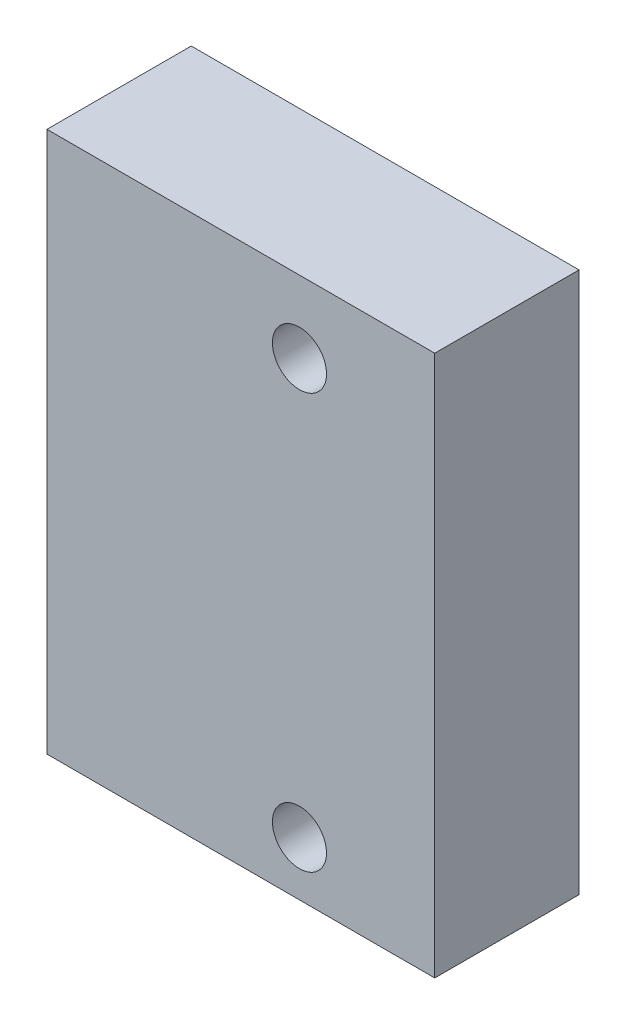
ISO-10303-21;
HEADER;
FILE_DESCRIPTION(('STEP AP214'),'2;1');
FILE_NAME('part.step','',(''),(''),'','','');
FILE_SCHEMA(('AUTOMOTIVE_DESIGN { 1 0 10303 214 1 1 1 1 }'));
ENDSEC;
DATA;
#1=APPLICATION_CONTEXT('core data for automotive mechanical design processes');
#2=APPLICATION_PROTOCOL_DEFINITION('international standard','automotive_design',2000,#1);
#3=PRODUCT_CONTEXT('',#1,'mechanical');
#4=PRODUCT('Part','Part','',(#3));
#5=PRODUCT_RELATED_PRODUCT_CATEGORY('part','',(#4));
#6=PRODUCT_DEFINITION_FORMATION('','',#4);
#7=PRODUCT_DEFINITION_CONTEXT('part definition',#1,'design');
#8=PRODUCT_DEFINITION('design','',#6,#7);
#9=PRODUCT_DEFINITION_SHAPE('','',#8);
#10=(LENGTH_UNIT() NAMED_UNIT(*) SI_UNIT(.MILLI.,.METRE.));
#11=(NAMED_UNIT(*) PLANE_ANGLE_UNIT() SI_UNIT($,.RADIAN.));
#12=(NAMED_UNIT(*) SI_UNIT($,.STERADIAN.) SOLID_ANGLE_UNIT());
#13=UNCERTAINTY_MEASURE_WITH_UNIT(LENGTH_MEASURE(1.E-05),#10,'distance_accuracy_value','');
#14=(GEOMETRIC_REPRESENTATION_CONTEXT(3) GLOBAL_UNCERTAINTY_ASSIGNED_CONTEXT((#13)) GLOBAL_UNIT_ASSIGNED_CONTEXT((#10,
#11,#12)) REPRESENTATION_CONTEXT('',''));
#15=CARTESIAN_POINT('',(0.,0.,0.));
#16=DIRECTION('',(0.,0.,1.));
#17=DIRECTION('',(1.,0.,0.));
#18=AXIS2_PLACEMENT_3D('',#15,#16,#17);
#19=CARTESIAN_POINT('',(0.,60.,16.));
#20=DIRECTION('',(-1.,0.,0.));
#21=DIRECTION('',(0.,0.,1.));
#22=AXIS2_PLACEMENT_3D('',#19,#20,#21);
#23=PLANE('',#22);
#24=DIRECTION('',(0.,1.,0.));
#25=VECTOR('',#24,1.);
#26=CARTESIAN_POINT('',(0.,60.,0.));
#27=LINE('',#26,#25);
#28=CARTESIAN_POINT('',(0.,0.,0.));
#29=VERTEX_POINT('',#28);
#30=CARTESIAN_POINT('',(0.,60.,0.));
#31=VERTEX_POINT('',#30);
#32=EDGE_CURVE('E122',#29,#31,#27,.T.);
#33=ORIENTED_EDGE('',*,*,#32,.T.);
#34=DIRECTION('',(0.,0.,-1.));
#35=VECTOR('',#34,1.);
#36=CARTESIAN_POINT('',(0.,60.,16.));
#37=LINE('',#36,#35);
#38=CARTESIAN_POINT('',(0.,60.,16.));
#39=VERTEX_POINT('',#38);
#40=EDGE_CURVE('E11',#39,#31,#37,.T.);
#41=ORIENTED_EDGE('',*,*,#40,.F.);
#42=DIRECTION('',(0.,1.,0.));
#43=VECTOR('',#42,1.);
#44=CARTESIAN_POINT('',(0.,60.,16.));
#45=LINE('',#44,#43);
#46=CARTESIAN_POINT('',(0.,0.,16.));
#47=VERTEX_POINT('',#46);
#48=EDGE_CURVE('E131',#47,#39,#45,.T.);
#49=ORIENTED_EDGE('',*,*,#48,.F.);
#50=DIRECTION('',(0.,0.,-1.));
#51=VECTOR('',#50,1.);
#52=CARTESIAN_POINT('',(0.,0.,16.));
#53=LINE('',#52,#51);
#54=EDGE_CURVE('E137',#47,#29,#53,.T.);
#55=ORIENTED_EDGE('',*,*,#54,.T.);
#56=EDGE_LOOP('',(#33,#41,#49,#55));
#57=FACE_BOUND('',#56,.T.);
#58=ADVANCED_FACE('F43',(#57),#23,.F.);
#59=CARTESIAN_POINT('',(-43.,60.,16.));
#60=DIRECTION('',(0.,-1.,0.));
#61=DIRECTION('',(0.,0.,-1.));
#62=AXIS2_PLACEMENT_3D('',#59,#60,#61);
#63=PLANE('',#62);
#64=DIRECTION('',(-1.,0.,0.));
#65=VECTOR('',#64,1.);
#66=CARTESIAN_POINT('',(-43.,60.,0.));
#67=LINE('',#66,#65);
#68=CARTESIAN_POINT('',(-43.,60.,0.));
#69=VERTEX_POINT('',#68);
#70=EDGE_CURVE('E140',#31,#69,#67,.T.);
#71=ORIENTED_EDGE('',*,*,#70,.T.);
#72=DIRECTION('',(0.,0.,-1.));
#73=VECTOR('',#72,1.);
#74=CARTESIAN_POINT('',(-43.,60.,16.));
#75=LINE('',#74,#73);
#76=CARTESIAN_POINT('',(-43.,60.,16.));
#77=VERTEX_POINT('',#76);
#78=EDGE_CURVE('E51',#77,#69,#75,.T.);
#79=ORIENTED_EDGE('',*,*,#78,.F.);
#80=DIRECTION('',(-1.,0.,0.));
#81=VECTOR('',#80,1.);
#82=CARTESIAN_POINT('',(-43.,60.,16.));
#83=LINE('',#82,#81);
#84=EDGE_CURVE('E90',#39,#77,#83,.T.);
#85=ORIENTED_EDGE('',*,*,#84,.F.);
#86=ORIENTED_EDGE('',*,*,#40,.T.);
#87=EDGE_LOOP('',(#71,#79,#85,#86));
#88=FACE_BOUND('',#87,.T.);
#89=ADVANCED_FACE('F164',(#88),#63,.F.);
#90=CARTESIAN_POINT('',(-43.,0.,16.));
#91=DIRECTION('',(1.,0.,0.));
#92=DIRECTION('',(0.,0.,-1.));
#93=AXIS2_PLACEMENT_3D('',#90,#91,#92);
#94=PLANE('',#93);
#95=CARTESIAN_POINT('',(-43.,42.,8.));
#96=DIRECTION('',(-1.,0.,0.));
#97=DIRECTION('',(0.,0.,1.));
#98=AXIS2_PLACEMENT_3D('',#95,#96,#97);
#99=CIRCLE('',#98,2.49999999999999);
#100=CARTESIAN_POINT('',(-43.,42.,10.5));
#101=VERTEX_POINT('',#100);
#102=EDGE_CURVE('E108',#101,#101,#99,.T.);
#103=ORIENTED_EDGE('',*,*,#102,.F.);
#104=EDGE_LOOP('',(#103));
#105=FACE_BOUND('',#104,.T.);
#106=CARTESIAN_POINT('',(-43.,18.,8.));
#107=DIRECTION('',(-1.,0.,0.));
#108=DIRECTION('',(0.,0.,1.));
#109=AXIS2_PLACEMENT_3D('',#106,#107,#108);
#110=CIRCLE('',#109,2.49999999999999);
#111=CARTESIAN_POINT('',(-43.,18.,10.5));
#112=VERTEX_POINT('',#111);
#113=EDGE_CURVE('E107',#112,#112,#110,.T.);
#114=ORIENTED_EDGE('',*,*,#113,.F.);
#115=EDGE_LOOP('',(#114));
#116=FACE_BOUND('',#115,.T.);
#117=DIRECTION('',(0.,-1.,0.));
#118=VECTOR('',#117,1.);
#119=CARTESIAN_POINT('',(-43.,0.,0.));
#120=LINE('',#119,#118);
#121=CARTESIAN_POINT('',(-43.,0.,0.));
#122=VERTEX_POINT('',#121);
#123=EDGE_CURVE('E77',#69,#122,#120,.T.);
#124=ORIENTED_EDGE('',*,*,#123,.T.);
#125=DIRECTION('',(0.,0.,-1.));
#126=VECTOR('',#125,1.);
#127=CARTESIAN_POINT('',(-43.,0.,16.));
#128=LINE('',#127,#126);
#129=CARTESIAN_POINT('',(-43.,0.,16.));
#130=VERTEX_POINT('',#129);
#131=EDGE_CURVE('E145',#130,#122,#128,.T.);
#132=ORIENTED_EDGE('',*,*,#131,.F.);
#133=DIRECTION('',(0.,-1.,0.));
#134=VECTOR('',#133,1.);
#135=CARTESIAN_POINT('',(-43.,0.,16.));
#136=LINE('',#135,#134);
#137=EDGE_CURVE('E134',#77,#130,#136,.T.);
#138=ORIENTED_EDGE('',*,*,#137,.F.);
#139=ORIENTED_EDGE('',*,*,#78,.T.);
#140=EDGE_LOOP('',(#124,#132,#138,#139));
#141=FACE_BOUND('',#140,.T.);
#142=ADVANCED_FACE('F147',(#105,#116,#141),#94,.F.);
#143=CARTESIAN_POINT('',(0.,0.,16.));
#144=DIRECTION('',(0.,1.,0.));
#145=DIRECTION('',(-1.,0.,0.));
#146=AXIS2_PLACEMENT_3D('',#143,#144,#145);
#147=PLANE('',#146);
#148=DIRECTION('',(1.,0.,0.));
#149=VECTOR('',#148,1.);
#150=CARTESIAN_POINT('',(0.,0.,0.));
#151=LINE('',#150,#149);
#152=EDGE_CURVE('E83',#122,#29,#151,.T.);
#153=ORIENTED_EDGE('',*,*,#152,.T.);
#154=ORIENTED_EDGE('',*,*,#54,.F.);
#155=DIRECTION('',(1.,0.,0.));
#156=VECTOR('',#155,1.);
#157=CARTESIAN_POINT('',(0.,0.,16.));
#158=LINE('',#157,#156);
#159=EDGE_CURVE('E59',#130,#47,#158,.T.);
#160=ORIENTED_EDGE('',*,*,#159,.F.);
#161=ORIENTED_EDGE('',*,*,#131,.T.);
#162=EDGE_LOOP('',(#153,#154,#160,#161));
#163=FACE_BOUND('',#162,.T.);
#164=ADVANCED_FACE('F154',(#163),#147,.F.);
#165=CARTESIAN_POINT('',(0.,0.,16.));
#166=DIRECTION('',(0.,0.,-1.));
#167=DIRECTION('',(-1.,0.,0.));
#168=AXIS2_PLACEMENT_3D('',#165,#166,#167);
#169=PLANE('',#168);
#170=CARTESIAN_POINT('',(-15.0000000000025,52.,16.));
#171=DIRECTION('',(0.,0.,-1.));
#172=DIRECTION('',(-1.,0.,0.));
#173=AXIS2_PLACEMENT_3D('',#170,#171,#172);
#174=CIRCLE('',#173,3.00000000000001);
#175=CARTESIAN_POINT('',(-18.0000000000025,52.,16.));
#176=VERTEX_POINT('',#175);
#177=EDGE_CURVE('E119',#176,#176,#174,.T.);
#178=ORIENTED_EDGE('',*,*,#177,.T.);
#179=EDGE_LOOP('',(#178));
#180=FACE_BOUND('',#179,.T.);
#181=CARTESIAN_POINT('',(-14.9999999999987,5.99999999999999,16.));
#182=DIRECTION('',(0.,0.,-1.));
#183=DIRECTION('',(-1.,0.,0.));
#184=AXIS2_PLACEMENT_3D('',#181,#182,#183);
#185=CIRCLE('',#184,3.);
#186=CARTESIAN_POINT('',(-17.9999999999987,5.99999999999999,16.));
#187=VERTEX_POINT('',#186);
#188=EDGE_CURVE('E118',#187,#187,#185,.T.);
#189=ORIENTED_EDGE('',*,*,#188,.T.);
#190=EDGE_LOOP('',(#189));
#191=FACE_BOUND('',#190,.T.);
#192=ORIENTED_EDGE('',*,*,#48,.T.);
#193=ORIENTED_EDGE('',*,*,#84,.T.);
#194=ORIENTED_EDGE('',*,*,#137,.T.);
#195=ORIENTED_EDGE('',*,*,#159,.T.);
#196=EDGE_LOOP('',(#192,#193,#194,#195));
#197=FACE_BOUND('',#196,.T.);
#198=ADVANCED_FACE('F156',(#180,#191,#197),#169,.F.);
#199=CARTESIAN_POINT('',(0.,0.,0.));
#200=DIRECTION('',(0.,0.,-1.));
#201=DIRECTION('',(-1.,0.,0.));
#202=AXIS2_PLACEMENT_3D('',#199,#200,#201);
#203=PLANE('',#202);
#204=CARTESIAN_POINT('',(-15.0000000000025,52.,0.));
#205=DIRECTION('',(0.,0.,-1.));
#206=DIRECTION('',(-1.,0.,0.));
#207=AXIS2_PLACEMENT_3D('',#204,#205,#206);
#208=CIRCLE('',#207,3.00000000000001);
#209=CARTESIAN_POINT('',(-18.0000000000025,52.,0.));
#210=VERTEX_POINT('',#209);
#211=EDGE_CURVE('E123',#210,#210,#208,.T.);
#212=ORIENTED_EDGE('',*,*,#211,.F.);
#213=EDGE_LOOP('',(#212));
#214=FACE_BOUND('',#213,.T.);
#215=CARTESIAN_POINT('',(-14.9999999999987,5.99999999999999,0.));
#216=DIRECTION('',(0.,0.,-1.));
#217=DIRECTION('',(-1.,0.,0.));
#218=AXIS2_PLACEMENT_3D('',#215,#216,#217);
#219=CIRCLE('',#218,3.);
#220=CARTESIAN_POINT('',(-17.9999999999987,5.99999999999999,0.));
#221=VERTEX_POINT('',#220);
#222=EDGE_CURVE('E126',#221,#221,#219,.T.);
#223=ORIENTED_EDGE('',*,*,#222,.F.);
#224=EDGE_LOOP('',(#223));
#225=FACE_BOUND('',#224,.T.);
#226=ORIENTED_EDGE('',*,*,#32,.F.);
#227=ORIENTED_EDGE('',*,*,#152,.F.);
#228=ORIENTED_EDGE('',*,*,#123,.F.);
#229=ORIENTED_EDGE('',*,*,#70,.F.);
#230=EDGE_LOOP('',(#226,#227,#228,#229));
#231=FACE_BOUND('',#230,.T.);
#232=ADVANCED_FACE('F150',(#214,#225,#231),#203,.T.);
#233=CARTESIAN_POINT('',(-14.9999999999987,5.99999999999999,16.));
#234=DIRECTION('',(0.,0.,-1.));
#235=DIRECTION('',(-1.,0.,0.));
#236=AXIS2_PLACEMENT_3D('',#233,#234,#235);
#237=CYLINDRICAL_SURFACE('',#236,3.);
#238=ORIENTED_EDGE('',*,*,#188,.F.);
#239=EDGE_LOOP('',(#238));
#240=FACE_BOUND('',#239,.T.);
#241=ORIENTED_EDGE('',*,*,#222,.T.);
#242=EDGE_LOOP('',(#241));
#243=FACE_BOUND('',#242,.T.);
#244=ADVANCED_FACE('F242',(#240,#243),#237,.F.);
#245=CARTESIAN_POINT('',(-15.0000000000025,52.,16.));
#246=DIRECTION('',(0.,0.,-1.));
#247=DIRECTION('',(-1.,0.,0.));
#248=AXIS2_PLACEMENT_3D('',#245,#246,#247);
#249=CYLINDRICAL_SURFACE('',#248,3.00000000000001);
#250=ORIENTED_EDGE('',*,*,#177,.F.);
#251=EDGE_LOOP('',(#250));
#252=FACE_BOUND('',#251,.T.);
#253=ORIENTED_EDGE('',*,*,#211,.T.);
#254=EDGE_LOOP('',(#253));
#255=FACE_BOUND('',#254,.T.);
#256=ADVANCED_FACE('F186',(#252,#255),#249,.F.);
#257=CARTESIAN_POINT('',(-33.,18.,8.));
#258=DIRECTION('',(-1.,0.,0.));
#259=DIRECTION('',(0.,0.,1.));
#260=AXIS2_PLACEMENT_3D('',#257,#258,#259);
#261=CONICAL_SURFACE('',#260,2.5,1.02974425867665);
#262=CARTESIAN_POINT('',(-31.4978484524311,18.,8.));
#263=VERTEX_POINT('',#262);
#264=VERTEX_LOOP('',#263);
#265=FACE_BOUND('',#264,.T.);
#266=CARTESIAN_POINT('',(-33.,18.,8.));
#267=DIRECTION('',(-1.,0.,0.));
#268=DIRECTION('',(0.,0.,1.));
#269=AXIS2_PLACEMENT_3D('',#266,#267,#268);
#270=CIRCLE('',#269,2.5);
#271=CARTESIAN_POINT('',(-33.,18.,10.5));
#272=VERTEX_POINT('',#271);
#273=EDGE_CURVE('E111',#272,#272,#270,.T.);
#274=ORIENTED_EDGE('',*,*,#273,.T.);
#275=EDGE_LOOP('',(#274));
#276=FACE_BOUND('',#275,.T.);
#277=ADVANCED_FACE('F191',(#265,#276),#261,.F.);
#278=CARTESIAN_POINT('',(-43.,18.,8.));
#279=DIRECTION('',(-1.,0.,0.));
#280=DIRECTION('',(0.,0.,1.));
#281=AXIS2_PLACEMENT_3D('',#278,#279,#280);
#282=CYLINDRICAL_SURFACE('',#281,2.49999999999999);
#283=ORIENTED_EDGE('',*,*,#273,.F.);
#284=EDGE_LOOP('',(#283));
#285=FACE_BOUND('',#284,.T.);
#286=ORIENTED_EDGE('',*,*,#113,.T.);
#287=EDGE_LOOP('',(#286));
#288=FACE_BOUND('',#287,.T.);
#289=ADVANCED_FACE('F101',(#285,#288),#282,.F.);
#290=CARTESIAN_POINT('',(-33.,42.,8.));
#291=DIRECTION('',(-1.,0.,0.));
#292=DIRECTION('',(0.,0.,1.));
#293=AXIS2_PLACEMENT_3D('',#290,#291,#292);
#294=CONICAL_SURFACE('',#293,2.5,1.02974425867665);
#295=CARTESIAN_POINT('',(-31.4978484524311,42.,8.));
#296=VERTEX_POINT('',#295);
#297=VERTEX_LOOP('',#296);
#298=FACE_BOUND('',#297,.T.);
#299=CARTESIAN_POINT('',(-33.,42.,8.));
#300=DIRECTION('',(-1.,0.,0.));
#301=DIRECTION('',(0.,0.,1.));
#302=AXIS2_PLACEMENT_3D('',#299,#300,#301);
#303=CIRCLE('',#302,2.5);
#304=CARTESIAN_POINT('',(-33.,42.,10.5));
#305=VERTEX_POINT('',#304);
#306=EDGE_CURVE('E105',#305,#305,#303,.T.);
#307=ORIENTED_EDGE('',*,*,#306,.T.);
#308=EDGE_LOOP('',(#307));
#309=FACE_BOUND('',#308,.T.);
#310=ADVANCED_FACE('F97',(#298,#309),#294,.F.);
#311=CARTESIAN_POINT('',(-43.,42.,8.));
#312=DIRECTION('',(-1.,0.,0.));
#313=DIRECTION('',(0.,0.,1.));
#314=AXIS2_PLACEMENT_3D('',#311,#312,#313);
#315=CYLINDRICAL_SURFACE('',#314,2.49999999999999);
#316=ORIENTED_EDGE('',*,*,#306,.F.);
#317=EDGE_LOOP('',(#316));
#318=FACE_BOUND('',#317,.T.);
#319=ORIENTED_EDGE('',*,*,#102,.T.);
#320=EDGE_LOOP('',(#319));
#321=FACE_BOUND('',#320,.T.);
#322=ADVANCED_FACE('F100',(#318,#321),#315,.F.);
#323=CLOSED_SHELL('',(#58,#89,#142,#164,#198,#232,#244,#256,#277,#289,#310,#322));
#324=MANIFOLD_SOLID_BREP('B2',#323);
#325=ADVANCED_BREP_SHAPE_REPRESENTATION('',(#18,#324),#14);
#326=SHAPE_DEFINITION_REPRESENTATION(#9,#325);
ENDSEC;
END-ISO-10303-21;
